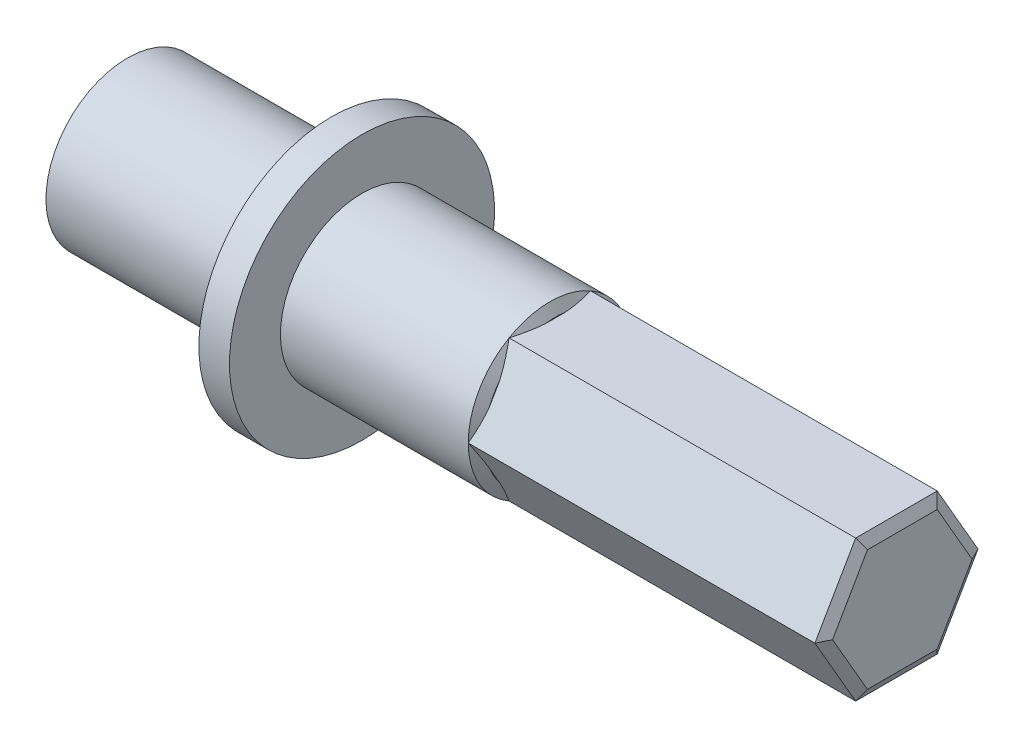
ISO-10303-21;
HEADER;
FILE_DESCRIPTION(('STEP AP214'),'2;1');
FILE_NAME('part.step','',(''),(''),'','','');
FILE_SCHEMA(('AUTOMOTIVE_DESIGN { 1 0 10303 214 1 1 1 1 }'));
ENDSEC;
DATA;
#1=APPLICATION_CONTEXT('core data for automotive mechanical design processes');
#2=APPLICATION_PROTOCOL_DEFINITION('international standard','automotive_design',2000,#1);
#3=PRODUCT_CONTEXT('',#1,'mechanical');
#4=PRODUCT('Part','Part','',(#3));
#5=PRODUCT_RELATED_PRODUCT_CATEGORY('part','',(#4));
#6=PRODUCT_DEFINITION_FORMATION('','',#4);
#7=PRODUCT_DEFINITION_CONTEXT('part definition',#1,'design');
#8=PRODUCT_DEFINITION('design','',#6,#7);
#9=PRODUCT_DEFINITION_SHAPE('','',#8);
#10=(LENGTH_UNIT() NAMED_UNIT(*) SI_UNIT(.MILLI.,.METRE.));
#11=(NAMED_UNIT(*) PLANE_ANGLE_UNIT() SI_UNIT($,.RADIAN.));
#12=(NAMED_UNIT(*) SI_UNIT($,.STERADIAN.) SOLID_ANGLE_UNIT());
#13=UNCERTAINTY_MEASURE_WITH_UNIT(LENGTH_MEASURE(1.E-05),#10,'distance_accuracy_value','');
#14=(GEOMETRIC_REPRESENTATION_CONTEXT(3) GLOBAL_UNCERTAINTY_ASSIGNED_CONTEXT((#13)) GLOBAL_UNIT_ASSIGNED_CONTEXT((#10,
#11,#12)) REPRESENTATION_CONTEXT('',''));
#15=CARTESIAN_POINT('',(0.,0.,0.));
#16=DIRECTION('',(0.,0.,1.));
#17=DIRECTION('',(1.,0.,0.));
#18=AXIS2_PLACEMENT_3D('',#15,#16,#17);
#19=CARTESIAN_POINT('',(28.,4.,0.));
#20=DIRECTION('',(1.,0.,0.));
#21=DIRECTION('',(0.,1.,0.));
#22=AXIS2_PLACEMENT_3D('',#19,#20,#21);
#23=PLANE('',#22);
#24=DIRECTION('',(0.,0.,1.));
#25=VECTOR('',#24,1.);
#26=CARTESIAN_POINT('',(28.,2.96410161513775,0.));
#27=LINE('',#26,#25);
#28=CARTESIAN_POINT('',(28.,2.96410161513775,-1.71132486540518));
#29=VERTEX_POINT('',#28);
#30=CARTESIAN_POINT('',(28.,2.96410161513775,1.71132486540518));
#31=VERTEX_POINT('',#30);
#32=EDGE_CURVE('E459',#29,#31,#27,.T.);
#33=ORIENTED_EDGE('',*,*,#32,.T.);
#34=DIRECTION('',(0.,-0.866025403784439,0.5));
#35=VECTOR('',#34,1.);
#36=CARTESIAN_POINT('',(28.,4.48205080756887,0.834936490538898));
#37=LINE('',#36,#35);
#38=CARTESIAN_POINT('',(28.,0.,3.42264973081036));
#39=VERTEX_POINT('',#38);
#40=EDGE_CURVE('E475',#31,#39,#37,.T.);
#41=ORIENTED_EDGE('',*,*,#40,.T.);
#42=DIRECTION('',(0.,-0.866025403784439,-0.5));
#43=VECTOR('',#42,1.);
#44=CARTESIAN_POINT('',(28.,1.51794919243113,4.29903810567665));
#45=LINE('',#44,#43);
#46=CARTESIAN_POINT('',(28.,-2.96410161513775,1.71132486540518));
#47=VERTEX_POINT('',#46);
#48=EDGE_CURVE('E485',#39,#47,#45,.T.);
#49=ORIENTED_EDGE('',*,*,#48,.T.);
#50=DIRECTION('',(0.,0.,-1.));
#51=VECTOR('',#50,1.);
#52=CARTESIAN_POINT('',(28.,-2.96410161513775,0.));
#53=LINE('',#52,#51);
#54=CARTESIAN_POINT('',(28.,-2.96410161513775,-1.71132486540518));
#55=VERTEX_POINT('',#54);
#56=EDGE_CURVE('E483',#47,#55,#53,.T.);
#57=ORIENTED_EDGE('',*,*,#56,.T.);
#58=DIRECTION('',(0.,0.866025403784439,-0.5));
#59=VECTOR('',#58,1.);
#60=CARTESIAN_POINT('',(28.,1.51794919243113,-4.29903810567665));
#61=LINE('',#60,#59);
#62=CARTESIAN_POINT('',(28.,0.,-3.42264973081037));
#63=VERTEX_POINT('',#62);
#64=EDGE_CURVE('E481',#55,#63,#61,.T.);
#65=ORIENTED_EDGE('',*,*,#64,.T.);
#66=DIRECTION('',(0.,0.866025403784439,0.5));
#67=VECTOR('',#66,1.);
#68=CARTESIAN_POINT('',(28.,4.48205080756887,-0.8349364905389));
#69=LINE('',#68,#67);
#70=EDGE_CURVE('E479',#63,#29,#69,.T.);
#71=ORIENTED_EDGE('',*,*,#70,.T.);
#72=EDGE_LOOP('',(#33,#41,#49,#57,#65,#71));
#73=FACE_BOUND('',#72,.T.);
#74=ADVANCED_FACE('F54',(#73),#23,.T.);
#75=CARTESIAN_POINT('',(28.,0.,0.));
#76=DIRECTION('',(1.,0.,0.));
#77=DIRECTION('',(0.,1.,0.));
#78=AXIS2_PLACEMENT_3D('',#75,#76,#77);
#79=CYLINDRICAL_SURFACE('',#78,4.);
#80=CARTESIAN_POINT('',(10.7113248654052,0.,0.));
#81=DIRECTION('',(-1.,0.,0.));
#82=DIRECTION('',(0.,-1.,0.));
#83=AXIS2_PLACEMENT_3D('',#80,#81,#82);
#84=CIRCLE('',#83,4.);
#85=CARTESIAN_POINT('',(10.7113248654052,3.46410161513775,2.00000000000001));
#86=VERTEX_POINT('',#85);
#87=CARTESIAN_POINT('',(10.7113248654052,3.46410161513776,-1.99999999999998));
#88=VERTEX_POINT('',#87);
#89=EDGE_CURVE('E184',#86,#88,#84,.T.);
#90=ORIENTED_EDGE('',*,*,#89,.T.);
#91=CARTESIAN_POINT('',(10.7113248654052,0.,0.));
#92=DIRECTION('',(-1.,0.,0.));
#93=DIRECTION('',(0.,-1.,0.));
#94=AXIS2_PLACEMENT_3D('',#91,#92,#93);
#95=CIRCLE('',#94,4.);
#96=CARTESIAN_POINT('',(10.7113248654052,0.,-4.));
#97=VERTEX_POINT('',#96);
#98=EDGE_CURVE('E206',#88,#97,#95,.T.);
#99=ORIENTED_EDGE('',*,*,#98,.T.);
#100=CARTESIAN_POINT('',(10.7113248654052,0.,0.));
#101=DIRECTION('',(-1.,0.,0.));
#102=DIRECTION('',(0.,-1.,0.));
#103=AXIS2_PLACEMENT_3D('',#100,#101,#102);
#104=CIRCLE('',#103,4.);
#105=CARTESIAN_POINT('',(10.7113248654052,-3.46410161513774,-2.00000000000001));
#106=VERTEX_POINT('',#105);
#107=EDGE_CURVE('E203',#97,#106,#104,.T.);
#108=ORIENTED_EDGE('',*,*,#107,.T.);
#109=CARTESIAN_POINT('',(10.7113248654052,0.,0.));
#110=DIRECTION('',(-1.,0.,0.));
#111=DIRECTION('',(0.,-1.,0.));
#112=AXIS2_PLACEMENT_3D('',#109,#110,#111);
#113=CIRCLE('',#112,4.);
#114=CARTESIAN_POINT('',(10.7113248654052,-3.46410161513776,1.99999999999998));
#115=VERTEX_POINT('',#114);
#116=EDGE_CURVE('E200',#106,#115,#113,.T.);
#117=ORIENTED_EDGE('',*,*,#116,.T.);
#118=CARTESIAN_POINT('',(10.7113248654052,0.,0.));
#119=DIRECTION('',(-1.,0.,0.));
#120=DIRECTION('',(0.,-1.,0.));
#121=AXIS2_PLACEMENT_3D('',#118,#119,#120);
#122=CIRCLE('',#121,4.);
#123=CARTESIAN_POINT('',(10.7113248654052,0.,4.));
#124=VERTEX_POINT('',#123);
#125=EDGE_CURVE('E197',#115,#124,#122,.T.);
#126=ORIENTED_EDGE('',*,*,#125,.T.);
#127=CARTESIAN_POINT('',(10.7113248654052,0.,0.));
#128=DIRECTION('',(-1.,0.,0.));
#129=DIRECTION('',(0.,-1.,0.));
#130=AXIS2_PLACEMENT_3D('',#127,#128,#129);
#131=CIRCLE('',#130,4.);
#132=EDGE_CURVE('E188',#124,#86,#131,.T.);
#133=ORIENTED_EDGE('',*,*,#132,.T.);
#134=EDGE_LOOP('',(#90,#99,#108,#117,#126,#133));
#135=FACE_BOUND('',#134,.T.);
#136=CARTESIAN_POINT('',(1.5,0.,0.));
#137=DIRECTION('',(1.,0.,0.));
#138=DIRECTION('',(0.,1.,0.));
#139=AXIS2_PLACEMENT_3D('',#136,#137,#138);
#140=CIRCLE('',#139,4.);
#141=CARTESIAN_POINT('',(1.5,4.,0.));
#142=VERTEX_POINT('',#141);
#143=EDGE_CURVE('E420',#142,#142,#140,.T.);
#144=ORIENTED_EDGE('',*,*,#143,.T.);
#145=EDGE_LOOP('',(#144));
#146=FACE_BOUND('',#145,.T.);
#147=ADVANCED_FACE('F331',(#135,#146),#79,.T.);
#148=CARTESIAN_POINT('',(-10.,0.,0.));
#149=DIRECTION('',(-1.,0.,0.));
#150=DIRECTION('',(0.,-1.,0.));
#151=AXIS2_PLACEMENT_3D('',#148,#149,#150);
#152=PLANE('',#151);
#153=CARTESIAN_POINT('',(-10.,0.,0.));
#154=DIRECTION('',(1.,0.,0.));
#155=DIRECTION('',(0.,1.,0.));
#156=AXIS2_PLACEMENT_3D('',#153,#154,#155);
#157=CIRCLE('',#156,4.);
#158=CARTESIAN_POINT('',(-10.,4.,0.));
#159=VERTEX_POINT('',#158);
#160=EDGE_CURVE('E185',#159,#159,#157,.T.);
#161=ORIENTED_EDGE('',*,*,#160,.F.);
#162=EDGE_LOOP('',(#161));
#163=FACE_BOUND('',#162,.T.);
#164=ADVANCED_FACE('F336',(#163),#152,.T.);
#165=CARTESIAN_POINT('',(28.,0.,0.));
#166=DIRECTION('',(1.,0.,0.));
#167=DIRECTION('',(0.,1.,0.));
#168=AXIS2_PLACEMENT_3D('',#165,#166,#167);
#169=CYLINDRICAL_SURFACE('',#168,4.);
#170=ORIENTED_EDGE('',*,*,#160,.T.);
#171=EDGE_LOOP('',(#170));
#172=FACE_BOUND('',#171,.T.);
#173=CARTESIAN_POINT('',(0.,0.,0.));
#174=DIRECTION('',(1.,0.,0.));
#175=DIRECTION('',(0.,1.,0.));
#176=AXIS2_PLACEMENT_3D('',#173,#174,#175);
#177=CIRCLE('',#176,4.);
#178=CARTESIAN_POINT('',(0.,4.,0.));
#179=VERTEX_POINT('',#178);
#180=EDGE_CURVE('E191',#179,#179,#177,.T.);
#181=ORIENTED_EDGE('',*,*,#180,.F.);
#182=EDGE_LOOP('',(#181));
#183=FACE_BOUND('',#182,.T.);
#184=ADVANCED_FACE('F342',(#172,#183),#169,.T.);
#185=CARTESIAN_POINT('',(0.,4.,0.));
#186=DIRECTION('',(-1.,0.,0.));
#187=DIRECTION('',(0.,-1.,0.));
#188=AXIS2_PLACEMENT_3D('',#185,#186,#187);
#189=PLANE('',#188);
#190=ORIENTED_EDGE('',*,*,#180,.T.);
#191=EDGE_LOOP('',(#190));
#192=FACE_BOUND('',#191,.T.);
#193=CARTESIAN_POINT('',(0.,0.,0.));
#194=DIRECTION('',(1.,0.,0.));
#195=DIRECTION('',(0.,1.,0.));
#196=AXIS2_PLACEMENT_3D('',#193,#194,#195);
#197=CIRCLE('',#196,6.5);
#198=CARTESIAN_POINT('',(0.,6.5,0.));
#199=VERTEX_POINT('',#198);
#200=EDGE_CURVE('E428',#199,#199,#197,.T.);
#201=ORIENTED_EDGE('',*,*,#200,.F.);
#202=EDGE_LOOP('',(#201));
#203=FACE_BOUND('',#202,.T.);
#204=ADVANCED_FACE('F346',(#192,#203),#189,.T.);
#205=CARTESIAN_POINT('',(28.,0.,0.));
#206=DIRECTION('',(1.,0.,0.));
#207=DIRECTION('',(0.,1.,0.));
#208=AXIS2_PLACEMENT_3D('',#205,#206,#207);
#209=CYLINDRICAL_SURFACE('',#208,6.5);
#210=ORIENTED_EDGE('',*,*,#200,.T.);
#211=EDGE_LOOP('',(#210));
#212=FACE_BOUND('',#211,.T.);
#213=CARTESIAN_POINT('',(1.5,0.,0.));
#214=DIRECTION('',(1.,0.,0.));
#215=DIRECTION('',(0.,1.,0.));
#216=AXIS2_PLACEMENT_3D('',#213,#214,#215);
#217=CIRCLE('',#216,6.5);
#218=CARTESIAN_POINT('',(1.5,6.5,0.));
#219=VERTEX_POINT('',#218);
#220=EDGE_CURVE('E425',#219,#219,#217,.T.);
#221=ORIENTED_EDGE('',*,*,#220,.F.);
#222=EDGE_LOOP('',(#221));
#223=FACE_BOUND('',#222,.T.);
#224=ADVANCED_FACE('F350',(#212,#223),#209,.T.);
#225=CARTESIAN_POINT('',(1.5,6.5,0.));
#226=DIRECTION('',(1.,0.,0.));
#227=DIRECTION('',(0.,1.,0.));
#228=AXIS2_PLACEMENT_3D('',#225,#226,#227);
#229=PLANE('',#228);
#230=ORIENTED_EDGE('',*,*,#220,.T.);
#231=EDGE_LOOP('',(#230));
#232=FACE_BOUND('',#231,.T.);
#233=ORIENTED_EDGE('',*,*,#143,.F.);
#234=EDGE_LOOP('',(#233));
#235=FACE_BOUND('',#234,.T.);
#236=ADVANCED_FACE('F354',(#232,#235),#229,.T.);
#237=CARTESIAN_POINT('',(11.,4.,0.));
#238=DIRECTION('',(-1.,0.,0.));
#239=DIRECTION('',(0.,-1.,0.));
#240=AXIS2_PLACEMENT_3D('',#237,#238,#239);
#241=PLANE('',#240);
#242=DIRECTION('',(0.,0.,1.));
#243=VECTOR('',#242,1.);
#244=CARTESIAN_POINT('',(11.,3.46410161513775,0.));
#245=LINE('',#244,#243);
#246=CARTESIAN_POINT('',(11.,3.46410161513775,-0.499999999999988));
#247=VERTEX_POINT('',#246);
#248=CARTESIAN_POINT('',(11.,3.46410161513775,0.499999999999987));
#249=VERTEX_POINT('',#248);
#250=EDGE_CURVE('E412',#247,#249,#245,.T.);
#251=ORIENTED_EDGE('',*,*,#250,.F.);
#252=CARTESIAN_POINT('',(11.,0.,0.));
#253=DIRECTION('',(-1.,0.,0.));
#254=DIRECTION('',(0.,-1.,0.));
#255=AXIS2_PLACEMENT_3D('',#252,#253,#254);
#256=CIRCLE('',#255,3.5);
#257=EDGE_CURVE('E217',#247,#249,#256,.F.);
#258=ORIENTED_EDGE('',*,*,#257,.T.);
#259=EDGE_LOOP('',(#251,#258));
#260=FACE_BOUND('',#259,.T.);
#261=ADVANCED_FACE('F357',(#260),#241,.F.);
#262=CARTESIAN_POINT('',(-4.03573872777933,3.46410161513775,0.));
#263=DIRECTION('',(0.,1.,0.));
#264=DIRECTION('',(0.,0.,1.));
#265=AXIS2_PLACEMENT_3D('',#262,#263,#264);
#266=PLANE('',#265);
#267=DIRECTION('',(1.,0.,0.));
#268=VECTOR('',#267,1.);
#269=CARTESIAN_POINT('',(-4.03573872777933,3.46410161513775,2.));
#270=LINE('',#269,#268);
#271=CARTESIAN_POINT('',(27.7113248654052,3.46410161513775,2.));
#272=VERTEX_POINT('',#271);
#273=EDGE_CURVE('E415',#86,#272,#270,.T.);
#274=ORIENTED_EDGE('',*,*,#273,.T.);
#275=DIRECTION('',(0.,0.,-1.));
#276=VECTOR('',#275,1.);
#277=CARTESIAN_POINT('',(27.7113248654052,3.46410161513775,0.));
#278=LINE('',#277,#276);
#279=CARTESIAN_POINT('',(27.7113248654052,3.46410161513775,-2.));
#280=VERTEX_POINT('',#279);
#281=EDGE_CURVE('E452',#272,#280,#278,.T.);
#282=ORIENTED_EDGE('',*,*,#281,.T.);
#283=DIRECTION('',(1.,0.,0.));
#284=VECTOR('',#283,1.);
#285=CARTESIAN_POINT('',(-4.03573872777933,3.46410161513775,-2.));
#286=LINE('',#285,#284);
#287=EDGE_CURVE('E418',#88,#280,#286,.T.);
#288=ORIENTED_EDGE('',*,*,#287,.F.);
#289=CARTESIAN_POINT('',(10.7113248654052,3.46410161513775,-2.));
#290=CARTESIAN_POINT('',(10.7467097894488,3.46410161513775,-1.87739674987939));
#291=CARTESIAN_POINT('',(10.7798660183443,3.46410161513775,-1.75411046031265));
#292=CARTESIAN_POINT('',(10.8407340080672,3.46410161513775,-1.50653263052453));
#293=CARTESIAN_POINT('',(10.8684590989994,3.46410161513775,-1.38224435131088));
#294=CARTESIAN_POINT('',(10.917674956433,3.46410161513775,-1.13235092918292));
#295=CARTESIAN_POINT('',(10.9391626055733,3.46410161513775,-1.0067451601911));
#296=CARTESIAN_POINT('',(10.9751031981516,3.46410161513775,-0.754219210198875));
#297=CARTESIAN_POINT('',(10.9895384810765,3.46410161513775,-0.627296534032624));
#298=CARTESIAN_POINT('',(11.,3.46410161513775,-0.499999999999959));
#299=B_SPLINE_CURVE_WITH_KNOTS('',3,(#289,#290,#291,#292,#293,#294,#295,#296,#297,#298),
.UNSPECIFIED.,.F.,.F.,(4,2,2,2,4),(0.,0.382857244019682,0.764762699916726,1.14685869795227,
1.52990669660289),.UNSPECIFIED.);
#300=EDGE_CURVE('E486',#88,#247,#299,.T.);
#301=ORIENTED_EDGE('',*,*,#300,.T.);
#302=ORIENTED_EDGE('',*,*,#250,.T.);
#303=CARTESIAN_POINT('',(11.,3.46410161513775,0.499999999999989));
#304=CARTESIAN_POINT('',(10.9895384810765,3.46410161513775,0.627296534032651));
#305=CARTESIAN_POINT('',(10.9751031981516,3.46410161513775,0.754219210198898));
#306=CARTESIAN_POINT('',(10.9391626055733,3.46410161513775,1.00674516019112));
#307=CARTESIAN_POINT('',(10.917674956433,3.46410161513775,1.13235092918293));
#308=CARTESIAN_POINT('',(10.8684590989993,3.46410161513775,1.38224435131089));
#309=CARTESIAN_POINT('',(10.8407340080672,3.46410161513775,1.50653263052453));
#310=CARTESIAN_POINT('',(10.7798660183443,3.46410161513775,1.75411046031266));
#311=CARTESIAN_POINT('',(10.7467097894488,3.46410161513775,1.87739674987939));
#312=CARTESIAN_POINT('',(10.7113248654052,3.46410161513775,2.));
#313=B_SPLINE_CURVE_WITH_KNOTS('',3,(#303,#304,#305,#306,#307,#308,#309,#310,#311,#312),
.UNSPECIFIED.,.F.,.F.,(4,2,2,2,4),(0.,0.383047998650611,0.765143996686143,1.14704945258318,
1.52990669660285),.UNSPECIFIED.);
#314=EDGE_CURVE('E267',#249,#86,#313,.T.);
#315=ORIENTED_EDGE('',*,*,#314,.T.);
#316=EDGE_LOOP('',(#274,#282,#288,#301,#302,#315));
#317=FACE_BOUND('',#316,.T.);
#318=ADVANCED_FACE('F363',(#317),#266,.T.);
#319=CARTESIAN_POINT('',(11.,4.,0.));
#320=DIRECTION('',(-1.,0.,0.));
#321=DIRECTION('',(0.,-1.,0.));
#322=AXIS2_PLACEMENT_3D('',#319,#320,#321);
#323=PLANE('',#322);
#324=DIRECTION('',(0.,-0.866025403784439,-0.5));
#325=VECTOR('',#324,1.);
#326=CARTESIAN_POINT('',(11.,-1.73205080756888,3.));
#327=LINE('',#326,#325);
#328=CARTESIAN_POINT('',(11.,-1.29903810567666,3.24999999999999));
#329=VERTEX_POINT('',#328);
#330=CARTESIAN_POINT('',(11.,-2.16506350946109,2.75));
#331=VERTEX_POINT('',#330);
#332=EDGE_CURVE('E385',#329,#331,#327,.T.);
#333=ORIENTED_EDGE('',*,*,#332,.F.);
#334=CARTESIAN_POINT('',(11.,0.,0.));
#335=DIRECTION('',(-1.,0.,0.));
#336=DIRECTION('',(0.,-1.,0.));
#337=AXIS2_PLACEMENT_3D('',#334,#335,#336);
#338=CIRCLE('',#337,3.5);
#339=EDGE_CURVE('E213',#329,#331,#338,.F.);
#340=ORIENTED_EDGE('',*,*,#339,.T.);
#341=EDGE_LOOP('',(#333,#340));
#342=FACE_BOUND('',#341,.T.);
#343=ADVANCED_FACE('F360',(#342),#323,.F.);
#344=CARTESIAN_POINT('',(-4.03573872777933,-1.73205080756888,3.));
#345=DIRECTION('',(0.,-0.5,0.866025403784439));
#346=DIRECTION('',(0.,-0.866025403784439,-0.5));
#347=AXIS2_PLACEMENT_3D('',#344,#345,#346);
#348=PLANE('',#347);
#349=DIRECTION('',(1.,0.,0.));
#350=VECTOR('',#349,1.);
#351=CARTESIAN_POINT('',(-4.03573872777933,-3.46410161513775,2.));
#352=LINE('',#351,#350);
#353=CARTESIAN_POINT('',(27.7113248654052,-3.46410161513775,2.));
#354=VERTEX_POINT('',#353);
#355=EDGE_CURVE('E383',#115,#354,#352,.T.);
#356=ORIENTED_EDGE('',*,*,#355,.T.);
#357=DIRECTION('',(0.,0.866025403784439,0.5));
#358=VECTOR('',#357,1.);
#359=CARTESIAN_POINT('',(27.7113248654052,-1.73205080756888,3.));
#360=LINE('',#359,#358);
#361=CARTESIAN_POINT('',(27.7113248654052,0.,4.));
#362=VERTEX_POINT('',#361);
#363=EDGE_CURVE('E13',#354,#362,#360,.T.);
#364=ORIENTED_EDGE('',*,*,#363,.T.);
#365=DIRECTION('',(1.,0.,0.));
#366=VECTOR('',#365,1.);
#367=CARTESIAN_POINT('',(-4.03573872777933,0.,4.));
#368=LINE('',#367,#366);
#369=EDGE_CURVE('E181',#124,#362,#368,.T.);
#370=ORIENTED_EDGE('',*,*,#369,.F.);
#371=CARTESIAN_POINT('',(10.7113248654052,0.,4.));
#372=CARTESIAN_POINT('',(10.7467097894488,-0.106177529190987,3.93869837493969));
#373=CARTESIAN_POINT('',(10.7798660183443,-0.212946587894101,3.87705523015632));
#374=CARTESIAN_POINT('',(10.8407340080672,-0.42735527790444,3.75326631526226));
#375=CARTESIAN_POINT('',(10.8684590989994,-0.534992085096109,3.69112217565544));
#376=CARTESIAN_POINT('',(10.917674956433,-0.751406136897555,3.56617546459146));
#377=CARTESIAN_POINT('',(10.9391626055733,-0.860183923706344,3.50337258009555));
#378=CARTESIAN_POINT('',(10.9751031981516,-1.07887781151441,3.37710960509944));
#379=CARTESIAN_POINT('',(10.9895384810765,-1.18879607339069,3.31364826701631));
#380=CARTESIAN_POINT('',(11.,-1.29903810567669,3.24999999999998));
#381=B_SPLINE_CURVE_WITH_KNOTS('',3,(#371,#372,#373,#374,#375,#376,#377,#378,#379,#380),
.UNSPECIFIED.,.F.,.F.,(4,2,2,2,4),(0.,0.382857244019681,0.764762699916724,1.14685869795226,
1.52990669660288),.UNSPECIFIED.);
#382=EDGE_CURVE('E371',#124,#329,#381,.T.);
#383=ORIENTED_EDGE('',*,*,#382,.T.);
#384=ORIENTED_EDGE('',*,*,#332,.T.);
#385=CARTESIAN_POINT('',(11.,-2.16506350946109,2.75));
#386=CARTESIAN_POINT('',(10.9895384810765,-2.27530554174708,2.68635173298367));
#387=CARTESIAN_POINT('',(10.9751031981516,-2.38522380362336,2.62289039490055));
#388=CARTESIAN_POINT('',(10.9391626055733,-2.60391769143142,2.49662741990444));
#389=CARTESIAN_POINT('',(10.917674956433,-2.71269547824021,2.43382453540853));
#390=CARTESIAN_POINT('',(10.8684590989993,-2.92910953004165,2.30887782434455));
#391=CARTESIAN_POINT('',(10.8407340080672,-3.03674633723332,2.24673368473773));
#392=CARTESIAN_POINT('',(10.7798660183443,-3.25115502724365,2.12294476984367));
#393=CARTESIAN_POINT('',(10.7467097894488,-3.35792408594676,2.0613016250603));
#394=CARTESIAN_POINT('',(10.7113248654052,-3.46410161513775,2.));
#395=B_SPLINE_CURVE_WITH_KNOTS('',3,(#385,#386,#387,#388,#389,#390,#391,#392,#393,#394),
.UNSPECIFIED.,.F.,.F.,(4,2,2,2,4),(0.,0.38304799865061,0.765143996686141,1.14704945258317,
1.52990669660285),.UNSPECIFIED.);
#396=EDGE_CURVE('E314',#331,#115,#395,.T.);
#397=ORIENTED_EDGE('',*,*,#396,.T.);
#398=EDGE_LOOP('',(#356,#364,#370,#383,#384,#397));
#399=FACE_BOUND('',#398,.T.);
#400=ADVANCED_FACE('F362',(#399),#348,.T.);
#401=CARTESIAN_POINT('',(11.,4.,0.));
#402=DIRECTION('',(-1.,0.,0.));
#403=DIRECTION('',(0.,-1.,0.));
#404=AXIS2_PLACEMENT_3D('',#401,#402,#403);
#405=PLANE('',#404);
#406=DIRECTION('',(0.,0.866025403784439,-0.5));
#407=VECTOR('',#406,1.);
#408=CARTESIAN_POINT('',(11.,-1.73205080756887,-3.));
#409=LINE('',#408,#407);
#410=CARTESIAN_POINT('',(11.,-2.16506350946108,-2.75));
#411=VERTEX_POINT('',#410);
#412=CARTESIAN_POINT('',(11.,-1.29903810567666,-3.24999999999999));
#413=VERTEX_POINT('',#412);
#414=EDGE_CURVE('E405',#411,#413,#409,.T.);
#415=ORIENTED_EDGE('',*,*,#414,.F.);
#416=CARTESIAN_POINT('',(11.,0.,0.));
#417=DIRECTION('',(-1.,0.,0.));
#418=DIRECTION('',(0.,-1.,0.));
#419=AXIS2_PLACEMENT_3D('',#416,#417,#418);
#420=CIRCLE('',#419,3.5);
#421=EDGE_CURVE('E209',#411,#413,#420,.F.);
#422=ORIENTED_EDGE('',*,*,#421,.T.);
#423=EDGE_LOOP('',(#415,#422));
#424=FACE_BOUND('',#423,.T.);
#425=ADVANCED_FACE('F368',(#424),#405,.F.);
#426=CARTESIAN_POINT('',(-4.03573872777933,-1.73205080756888,-3.));
#427=DIRECTION('',(0.,-0.5,-0.866025403784439));
#428=DIRECTION('',(0.,0.866025403784439,-0.5));
#429=AXIS2_PLACEMENT_3D('',#426,#427,#428);
#430=PLANE('',#429);
#431=DIRECTION('',(1.,0.,0.));
#432=VECTOR('',#431,1.);
#433=CARTESIAN_POINT('',(-4.03573872777933,0.,-4.));
#434=LINE('',#433,#432);
#435=CARTESIAN_POINT('',(27.7113248654052,0.,-4.));
#436=VERTEX_POINT('',#435);
#437=EDGE_CURVE('E169',#97,#436,#434,.T.);
#438=ORIENTED_EDGE('',*,*,#437,.T.);
#439=DIRECTION('',(0.,-0.866025403784439,0.5));
#440=VECTOR('',#439,1.);
#441=CARTESIAN_POINT('',(27.7113248654052,-1.73205080756887,-3.));
#442=LINE('',#441,#440);
#443=CARTESIAN_POINT('',(27.7113248654052,-3.46410161513775,-2.));
#444=VERTEX_POINT('',#443);
#445=EDGE_CURVE('E79',#436,#444,#442,.T.);
#446=ORIENTED_EDGE('',*,*,#445,.T.);
#447=DIRECTION('',(1.,0.,0.));
#448=VECTOR('',#447,1.);
#449=CARTESIAN_POINT('',(-4.03573872777933,-3.46410161513775,-2.));
#450=LINE('',#449,#448);
#451=EDGE_CURVE('E397',#106,#444,#450,.T.);
#452=ORIENTED_EDGE('',*,*,#451,.F.);
#453=CARTESIAN_POINT('',(10.7113248654052,-3.46410161513775,-2.));
#454=CARTESIAN_POINT('',(10.7467097894488,-3.35792408594677,-2.0613016250603));
#455=CARTESIAN_POINT('',(10.7798660183443,-3.25115502724365,-2.12294476984367));
#456=CARTESIAN_POINT('',(10.8407340080672,-3.03674633723331,-2.24673368473774));
#457=CARTESIAN_POINT('',(10.8684590989994,-2.92910953004164,-2.30887782434456));
#458=CARTESIAN_POINT('',(10.917674956433,-2.7126954782402,-2.43382453540854));
#459=CARTESIAN_POINT('',(10.9391626055733,-2.60391769143141,-2.49662741990445));
#460=CARTESIAN_POINT('',(10.9751031981516,-2.38522380362334,-2.62289039490056));
#461=CARTESIAN_POINT('',(10.9895384810765,-2.27530554174706,-2.68635173298369));
#462=CARTESIAN_POINT('',(11.,-2.16506350946106,-2.75000000000002));
#463=B_SPLINE_CURVE_WITH_KNOTS('',3,(#453,#454,#455,#456,#457,#458,#459,#460,#461,#462),
.UNSPECIFIED.,.F.,.F.,(4,2,2,2,4),(0.,0.382857244019684,0.764762699916727,1.14685869795227,
1.52990669660289),.UNSPECIFIED.);
#464=EDGE_CURVE('E507',#106,#411,#463,.T.);
#465=ORIENTED_EDGE('',*,*,#464,.T.);
#466=ORIENTED_EDGE('',*,*,#414,.T.);
#467=CARTESIAN_POINT('',(11.,-1.29903810567666,-3.24999999999999));
#468=CARTESIAN_POINT('',(10.9895384810765,-1.18879607339067,-3.31364826701633));
#469=CARTESIAN_POINT('',(10.9751031981516,-1.07887781151439,-3.37710960509945));
#470=CARTESIAN_POINT('',(10.9391626055733,-0.860183923706327,-3.50337258009556));
#471=CARTESIAN_POINT('',(10.917674956433,-0.751406136897541,-3.56617546459146));
#472=CARTESIAN_POINT('',(10.8684590989993,-0.534992085096099,-3.69112217565544));
#473=CARTESIAN_POINT('',(10.8407340080672,-0.427355277904433,-3.75326631526226));
#474=CARTESIAN_POINT('',(10.7798660183443,-0.212946587894099,-3.87705523015633));
#475=CARTESIAN_POINT('',(10.7467097894488,-0.106177529190988,-3.93869837493969));
#476=CARTESIAN_POINT('',(10.7113248654052,0.,-3.99999999999999));
#477=B_SPLINE_CURVE_WITH_KNOTS('',3,(#467,#468,#469,#470,#471,#472,#473,#474,#475,#476),
.UNSPECIFIED.,.F.,.F.,(4,2,2,2,4),(0.,0.383047998650609,0.76514399668614,1.14704945258317,
1.52990669660285),.UNSPECIFIED.);
#478=EDGE_CURVE('E174',#413,#97,#477,.T.);
#479=ORIENTED_EDGE('',*,*,#478,.T.);
#480=EDGE_LOOP('',(#438,#446,#452,#465,#466,#479));
#481=FACE_BOUND('',#480,.T.);
#482=ADVANCED_FACE('F244',(#481),#430,.T.);
#483=CARTESIAN_POINT('',(11.,4.,0.));
#484=DIRECTION('',(-1.,0.,0.));
#485=DIRECTION('',(0.,-1.,0.));
#486=AXIS2_PLACEMENT_3D('',#483,#484,#485);
#487=PLANE('',#486);
#488=DIRECTION('',(0.,0.866025403784439,0.5));
#489=VECTOR('',#488,1.);
#490=CARTESIAN_POINT('',(11.,1.73205080756887,-3.));
#491=LINE('',#490,#489);
#492=CARTESIAN_POINT('',(11.,1.29903810567666,-3.25));
#493=VERTEX_POINT('',#492);
#494=CARTESIAN_POINT('',(11.,2.16506350946109,-2.75));
#495=VERTEX_POINT('',#494);
#496=EDGE_CURVE('E168',#493,#495,#491,.T.);
#497=ORIENTED_EDGE('',*,*,#496,.F.);
#498=CARTESIAN_POINT('',(11.,0.,0.));
#499=DIRECTION('',(-1.,0.,0.));
#500=DIRECTION('',(0.,-1.,0.));
#501=AXIS2_PLACEMENT_3D('',#498,#499,#500);
#502=CIRCLE('',#501,3.5);
#503=EDGE_CURVE('E180',#493,#495,#502,.F.);
#504=ORIENTED_EDGE('',*,*,#503,.T.);
#505=EDGE_LOOP('',(#497,#504));
#506=FACE_BOUND('',#505,.T.);
#507=ADVANCED_FACE('F179',(#506),#487,.F.);
#508=CARTESIAN_POINT('',(-4.03573872777933,1.73205080756887,-3.));
#509=DIRECTION('',(0.,0.5,-0.866025403784439));
#510=DIRECTION('',(0.,0.866025403784439,0.5));
#511=AXIS2_PLACEMENT_3D('',#508,#509,#510);
#512=PLANE('',#511);
#513=ORIENTED_EDGE('',*,*,#287,.T.);
#514=DIRECTION('',(0.,-0.866025403784439,-0.5));
#515=VECTOR('',#514,1.);
#516=CARTESIAN_POINT('',(27.7113248654052,1.73205080756888,-3.));
#517=LINE('',#516,#515);
#518=EDGE_CURVE('E441',#280,#436,#517,.T.);
#519=ORIENTED_EDGE('',*,*,#518,.T.);
#520=ORIENTED_EDGE('',*,*,#437,.F.);
#521=CARTESIAN_POINT('',(10.7113248654052,0.,-4.));
#522=CARTESIAN_POINT('',(10.7467097894488,0.106177529190986,-3.93869837493969));
#523=CARTESIAN_POINT('',(10.7798660183443,0.2129465878941,-3.87705523015633));
#524=CARTESIAN_POINT('',(10.8407340080672,0.427355277904439,-3.75326631526226));
#525=CARTESIAN_POINT('',(10.8684590989994,0.534992085096108,-3.69112217565544));
#526=CARTESIAN_POINT('',(10.917674956433,0.751406136897554,-3.56617546459146));
#527=CARTESIAN_POINT('',(10.9391626055733,0.860183923706343,-3.50337258009555));
#528=CARTESIAN_POINT('',(10.9751031981516,1.07887781151441,-3.37710960509944));
#529=CARTESIAN_POINT('',(10.9895384810765,1.18879607339069,-3.31364826701631));
#530=CARTESIAN_POINT('',(11.,1.29903810567669,-3.24999999999998));
#531=B_SPLINE_CURVE_WITH_KNOTS('',3,(#521,#522,#523,#524,#525,#526,#527,#528,#529,#530),
.UNSPECIFIED.,.F.,.F.,(4,2,2,2,4),(0.,0.382857244019682,0.764762699916724,1.14685869795226,
1.52990669660288),.UNSPECIFIED.);
#532=EDGE_CURVE('E163',#97,#493,#531,.T.);
#533=ORIENTED_EDGE('',*,*,#532,.T.);
#534=ORIENTED_EDGE('',*,*,#496,.T.);
#535=CARTESIAN_POINT('',(11.,2.16506350946109,-2.75));
#536=CARTESIAN_POINT('',(10.9895384810765,2.27530554174709,-2.68635173298367));
#537=CARTESIAN_POINT('',(10.9751031981516,2.38522380362336,-2.62289039490055));
#538=CARTESIAN_POINT('',(10.9391626055733,2.60391769143143,-2.49662741990443));
#539=CARTESIAN_POINT('',(10.917674956433,2.71269547824021,-2.43382453540853));
#540=CARTESIAN_POINT('',(10.8684590989993,2.92910953004165,-2.30887782434455));
#541=CARTESIAN_POINT('',(10.8407340080672,3.03674633723332,-2.24673368473773));
#542=CARTESIAN_POINT('',(10.7798660183443,3.25115502724365,-2.12294476984367));
#543=CARTESIAN_POINT('',(10.7467097894488,3.35792408594677,-2.0613016250603));
#544=CARTESIAN_POINT('',(10.7113248654052,3.46410161513775,-2.));
#545=B_SPLINE_CURVE_WITH_KNOTS('',3,(#535,#536,#537,#538,#539,#540,#541,#542,#543,#544),
.UNSPECIFIED.,.F.,.F.,(4,2,2,2,4),(0.,0.38304799865061,0.765143996686141,1.14704945258317,
1.52990669660285),.UNSPECIFIED.);
#546=EDGE_CURVE('E175',#495,#88,#545,.T.);
#547=ORIENTED_EDGE('',*,*,#546,.T.);
#548=EDGE_LOOP('',(#513,#519,#520,#533,#534,#547));
#549=FACE_BOUND('',#548,.T.);
#550=ADVANCED_FACE('F166',(#549),#512,.T.);
#551=CARTESIAN_POINT('',(11.,4.,0.));
#552=DIRECTION('',(-1.,0.,0.));
#553=DIRECTION('',(0.,-1.,0.));
#554=AXIS2_PLACEMENT_3D('',#551,#552,#553);
#555=PLANE('',#554);
#556=DIRECTION('',(0.,-0.866025403784439,0.5));
#557=VECTOR('',#556,1.);
#558=CARTESIAN_POINT('',(11.,1.73205080756887,3.));
#559=LINE('',#558,#557);
#560=CARTESIAN_POINT('',(11.,2.16506350946109,2.75));
#561=VERTEX_POINT('',#560);
#562=CARTESIAN_POINT('',(11.,1.29903810567666,3.25));
#563=VERTEX_POINT('',#562);
#564=EDGE_CURVE('E399',#561,#563,#559,.T.);
#565=ORIENTED_EDGE('',*,*,#564,.F.);
#566=CARTESIAN_POINT('',(11.,0.,0.));
#567=DIRECTION('',(-1.,0.,0.));
#568=DIRECTION('',(0.,-1.,0.));
#569=AXIS2_PLACEMENT_3D('',#566,#567,#568);
#570=CIRCLE('',#569,3.5);
#571=EDGE_CURVE('E215',#561,#563,#570,.F.);
#572=ORIENTED_EDGE('',*,*,#571,.T.);
#573=EDGE_LOOP('',(#565,#572));
#574=FACE_BOUND('',#573,.T.);
#575=ADVANCED_FACE('F238',(#574),#555,.F.);
#576=CARTESIAN_POINT('',(-4.03573872777933,1.73205080756887,3.));
#577=DIRECTION('',(0.,0.5,0.866025403784439));
#578=DIRECTION('',(0.,-0.866025403784439,0.5));
#579=AXIS2_PLACEMENT_3D('',#576,#577,#578);
#580=PLANE('',#579);
#581=ORIENTED_EDGE('',*,*,#369,.T.);
#582=DIRECTION('',(0.,0.866025403784439,-0.5));
#583=VECTOR('',#582,1.);
#584=CARTESIAN_POINT('',(27.7113248654052,1.73205080756888,3.));
#585=LINE('',#584,#583);
#586=EDGE_CURVE('E473',#362,#272,#585,.T.);
#587=ORIENTED_EDGE('',*,*,#586,.T.);
#588=ORIENTED_EDGE('',*,*,#273,.F.);
#589=CARTESIAN_POINT('',(10.7113248654052,3.46410161513775,2.));
#590=CARTESIAN_POINT('',(10.7467097894488,3.35792408594677,2.0613016250603));
#591=CARTESIAN_POINT('',(10.7798660183443,3.25115502724365,2.12294476984367));
#592=CARTESIAN_POINT('',(10.8407340080672,3.03674633723331,2.24673368473773));
#593=CARTESIAN_POINT('',(10.8684590989994,2.92910953004165,2.30887782434455));
#594=CARTESIAN_POINT('',(10.917674956433,2.7126954782402,2.43382453540853));
#595=CARTESIAN_POINT('',(10.9391626055733,2.60391769143141,2.49662741990444));
#596=CARTESIAN_POINT('',(10.9751031981516,2.38522380362335,2.62289039490055));
#597=CARTESIAN_POINT('',(10.9895384810765,2.27530554174707,2.68635173298368));
#598=CARTESIAN_POINT('',(11.,2.16506350946107,2.75000000000001));
#599=B_SPLINE_CURVE_WITH_KNOTS('',3,(#589,#590,#591,#592,#593,#594,#595,#596,#597,#598),
.UNSPECIFIED.,.F.,.F.,(4,2,2,2,4),(0.,0.38285724401968,0.764762699916721,1.14685869795226,
1.52990669660287),.UNSPECIFIED.);
#600=EDGE_CURVE('E261',#86,#561,#599,.T.);
#601=ORIENTED_EDGE('',*,*,#600,.T.);
#602=ORIENTED_EDGE('',*,*,#564,.T.);
#603=CARTESIAN_POINT('',(11.,1.29903810567665,3.25));
#604=CARTESIAN_POINT('',(10.9895384810765,1.18879607339066,3.31364826701633));
#605=CARTESIAN_POINT('',(10.9751031981516,1.07887781151438,3.37710960509945));
#606=CARTESIAN_POINT('',(10.9391626055733,0.860183923706323,3.50337258009556));
#607=CARTESIAN_POINT('',(10.917674956433,0.751406136897537,3.56617546459147));
#608=CARTESIAN_POINT('',(10.8684590989993,0.534992085096096,3.69112217565545));
#609=CARTESIAN_POINT('',(10.8407340080672,0.42735527790443,3.75326631526227));
#610=CARTESIAN_POINT('',(10.7798660183443,0.212946587894096,3.87705523015633));
#611=CARTESIAN_POINT('',(10.7467097894488,0.106177529190985,3.93869837493969));
#612=CARTESIAN_POINT('',(10.7113248654052,0.,4.));
#613=B_SPLINE_CURVE_WITH_KNOTS('',3,(#603,#604,#605,#606,#607,#608,#609,#610,#611,#612),
.UNSPECIFIED.,.F.,.F.,(4,2,2,2,4),(0.,0.383047998650608,0.765143996686138,1.14704945258317,
1.52990669660284),.UNSPECIFIED.);
#614=EDGE_CURVE('E253',#563,#124,#613,.T.);
#615=ORIENTED_EDGE('',*,*,#614,.T.);
#616=EDGE_LOOP('',(#581,#587,#588,#601,#602,#615));
#617=FACE_BOUND('',#616,.T.);
#618=ADVANCED_FACE('F245',(#617),#580,.T.);
#619=CARTESIAN_POINT('',(11.,4.,0.));
#620=DIRECTION('',(-1.,0.,0.));
#621=DIRECTION('',(0.,-1.,0.));
#622=AXIS2_PLACEMENT_3D('',#619,#620,#621);
#623=PLANE('',#622);
#624=DIRECTION('',(0.,0.,-1.));
#625=VECTOR('',#624,1.);
#626=CARTESIAN_POINT('',(11.,-3.46410161513775,0.));
#627=LINE('',#626,#625);
#628=CARTESIAN_POINT('',(11.,-3.46410161513775,0.499999999999982));
#629=VERTEX_POINT('',#628);
#630=CARTESIAN_POINT('',(11.,-3.46410161513775,-0.499999999999982));
#631=VERTEX_POINT('',#630);
#632=EDGE_CURVE('E396',#629,#631,#627,.T.);
#633=ORIENTED_EDGE('',*,*,#632,.F.);
#634=CARTESIAN_POINT('',(11.,0.,0.));
#635=DIRECTION('',(-1.,0.,0.));
#636=DIRECTION('',(0.,-1.,0.));
#637=AXIS2_PLACEMENT_3D('',#634,#635,#636);
#638=CIRCLE('',#637,3.5);
#639=EDGE_CURVE('E211',#629,#631,#638,.F.);
#640=ORIENTED_EDGE('',*,*,#639,.T.);
#641=EDGE_LOOP('',(#633,#640));
#642=FACE_BOUND('',#641,.T.);
#643=ADVANCED_FACE('F239',(#642),#623,.F.);
#644=CARTESIAN_POINT('',(-4.03573872777933,-3.46410161513775,0.));
#645=DIRECTION('',(0.,-1.,0.));
#646=DIRECTION('',(1.,0.,0.));
#647=AXIS2_PLACEMENT_3D('',#644,#645,#646);
#648=PLANE('',#647);
#649=ORIENTED_EDGE('',*,*,#451,.T.);
#650=DIRECTION('',(0.,0.,1.));
#651=VECTOR('',#650,1.);
#652=CARTESIAN_POINT('',(27.7113248654052,-3.46410161513775,0.));
#653=LINE('',#652,#651);
#654=EDGE_CURVE('E64',#444,#354,#653,.T.);
#655=ORIENTED_EDGE('',*,*,#654,.T.);
#656=ORIENTED_EDGE('',*,*,#355,.F.);
#657=CARTESIAN_POINT('',(10.7113248654052,-3.46410161513775,2.));
#658=CARTESIAN_POINT('',(10.7467097894488,-3.46410161513775,1.87739674987939));
#659=CARTESIAN_POINT('',(10.7798660183443,-3.46410161513775,1.75411046031265));
#660=CARTESIAN_POINT('',(10.8407340080672,-3.46410161513775,1.50653263052452));
#661=CARTESIAN_POINT('',(10.8684590989994,-3.46410161513775,1.38224435131088));
#662=CARTESIAN_POINT('',(10.917674956433,-3.46410161513775,1.13235092918291));
#663=CARTESIAN_POINT('',(10.9391626055733,-3.46410161513775,1.0067451601911));
#664=CARTESIAN_POINT('',(10.9751031981516,-3.46410161513775,0.75421921019887));
#665=CARTESIAN_POINT('',(10.9895384810765,-3.46410161513775,0.627296534032619));
#666=CARTESIAN_POINT('',(11.,-3.46410161513775,0.499999999999953));
#667=B_SPLINE_CURVE_WITH_KNOTS('',3,(#657,#658,#659,#660,#661,#662,#663,#664,#665,#666),
.UNSPECIFIED.,.F.,.F.,(4,2,2,2,4),(0.,0.382857244019685,0.76476269991673,1.14685869795227,
1.52990669660289),.UNSPECIFIED.);
#668=EDGE_CURVE('E308',#115,#629,#667,.T.);
#669=ORIENTED_EDGE('',*,*,#668,.T.);
#670=ORIENTED_EDGE('',*,*,#632,.T.);
#671=CARTESIAN_POINT('',(11.,-3.46410161513775,-0.499999999999982));
#672=CARTESIAN_POINT('',(10.9895384810765,-3.46410161513775,-0.627296534032645));
#673=CARTESIAN_POINT('',(10.9751031981516,-3.46410161513775,-0.754219210198893));
#674=CARTESIAN_POINT('',(10.9391626055733,-3.46410161513775,-1.00674516019112));
#675=CARTESIAN_POINT('',(10.917674956433,-3.46410161513775,-1.13235092918293));
#676=CARTESIAN_POINT('',(10.8684590989993,-3.46410161513775,-1.38224435131089));
#677=CARTESIAN_POINT('',(10.8407340080672,-3.46410161513775,-1.50653263052453));
#678=CARTESIAN_POINT('',(10.7798660183443,-3.46410161513775,-1.75411046031266));
#679=CARTESIAN_POINT('',(10.7467097894488,-3.46410161513775,-1.87739674987938));
#680=CARTESIAN_POINT('',(10.7113248654052,-3.46410161513775,-2.));
#681=B_SPLINE_CURVE_WITH_KNOTS('',3,(#671,#672,#673,#674,#675,#676,#677,#678,#679,#680),
.UNSPECIFIED.,.F.,.F.,(4,2,2,2,4),(0.,0.383047998650612,0.765143996686146,1.14704945258318,
1.52990669660286),.UNSPECIFIED.);
#682=EDGE_CURVE('E301',#631,#106,#681,.T.);
#683=ORIENTED_EDGE('',*,*,#682,.T.);
#684=EDGE_LOOP('',(#649,#655,#656,#669,#670,#683));
#685=FACE_BOUND('',#684,.T.);
#686=ADVANCED_FACE('F320',(#685),#648,.T.);
#687=CARTESIAN_POINT('',(11.,0.,0.));
#688=DIRECTION('',(-1.,0.,0.));
#689=DIRECTION('',(0.,-1.,0.));
#690=AXIS2_PLACEMENT_3D('',#687,#688,#689);
#691=CONICAL_SURFACE('',#690,3.5,1.0471975511966);
#692=ORIENTED_EDGE('',*,*,#382,.F.);
#693=ORIENTED_EDGE('',*,*,#125,.F.);
#694=ORIENTED_EDGE('',*,*,#396,.F.);
#695=ORIENTED_EDGE('',*,*,#339,.F.);
#696=EDGE_LOOP('',(#692,#693,#694,#695));
#697=FACE_BOUND('',#696,.T.);
#698=ADVANCED_FACE('F295',(#697),#691,.T.);
#699=CARTESIAN_POINT('',(11.,0.,0.));
#700=DIRECTION('',(-1.,0.,0.));
#701=DIRECTION('',(0.,-1.,0.));
#702=AXIS2_PLACEMENT_3D('',#699,#700,#701);
#703=CONICAL_SURFACE('',#702,3.5,1.0471975511966);
#704=ORIENTED_EDGE('',*,*,#668,.F.);
#705=ORIENTED_EDGE('',*,*,#116,.F.);
#706=ORIENTED_EDGE('',*,*,#682,.F.);
#707=ORIENTED_EDGE('',*,*,#639,.F.);
#708=EDGE_LOOP('',(#704,#705,#706,#707));
#709=FACE_BOUND('',#708,.T.);
#710=ADVANCED_FACE('F285',(#709),#703,.T.);
#711=CARTESIAN_POINT('',(11.,0.,0.));
#712=DIRECTION('',(-1.,0.,0.));
#713=DIRECTION('',(0.,-1.,0.));
#714=AXIS2_PLACEMENT_3D('',#711,#712,#713);
#715=CONICAL_SURFACE('',#714,3.5,1.0471975511966);
#716=ORIENTED_EDGE('',*,*,#571,.F.);
#717=ORIENTED_EDGE('',*,*,#600,.F.);
#718=ORIENTED_EDGE('',*,*,#132,.F.);
#719=ORIENTED_EDGE('',*,*,#614,.F.);
#720=EDGE_LOOP('',(#716,#717,#718,#719));
#721=FACE_BOUND('',#720,.T.);
#722=ADVANCED_FACE('F275',(#721),#715,.T.);
#723=CARTESIAN_POINT('',(11.,0.,0.));
#724=DIRECTION('',(-1.,0.,0.));
#725=DIRECTION('',(0.,-1.,0.));
#726=AXIS2_PLACEMENT_3D('',#723,#724,#725);
#727=CONICAL_SURFACE('',#726,3.5,1.0471975511966);
#728=ORIENTED_EDGE('',*,*,#464,.F.);
#729=ORIENTED_EDGE('',*,*,#107,.F.);
#730=ORIENTED_EDGE('',*,*,#478,.F.);
#731=ORIENTED_EDGE('',*,*,#421,.F.);
#732=EDGE_LOOP('',(#728,#729,#730,#731));
#733=FACE_BOUND('',#732,.T.);
#734=ADVANCED_FACE('F284',(#733),#727,.T.);
#735=CARTESIAN_POINT('',(11.,0.,0.));
#736=DIRECTION('',(-1.,0.,0.));
#737=DIRECTION('',(0.,-1.,0.));
#738=AXIS2_PLACEMENT_3D('',#735,#736,#737);
#739=CONICAL_SURFACE('',#738,3.5,1.0471975511966);
#740=ORIENTED_EDGE('',*,*,#257,.F.);
#741=ORIENTED_EDGE('',*,*,#300,.F.);
#742=ORIENTED_EDGE('',*,*,#89,.F.);
#743=ORIENTED_EDGE('',*,*,#314,.F.);
#744=EDGE_LOOP('',(#740,#741,#742,#743));
#745=FACE_BOUND('',#744,.T.);
#746=ADVANCED_FACE('F492',(#745),#739,.T.);
#747=CARTESIAN_POINT('',(11.,0.,0.));
#748=DIRECTION('',(-1.,0.,0.));
#749=DIRECTION('',(0.,-1.,0.));
#750=AXIS2_PLACEMENT_3D('',#747,#748,#749);
#751=CONICAL_SURFACE('',#750,3.5,1.0471975511966);
#752=ORIENTED_EDGE('',*,*,#532,.F.);
#753=ORIENTED_EDGE('',*,*,#98,.F.);
#754=ORIENTED_EDGE('',*,*,#546,.F.);
#755=ORIENTED_EDGE('',*,*,#503,.F.);
#756=EDGE_LOOP('',(#752,#753,#754,#755));
#757=FACE_BOUND('',#756,.T.);
#758=ADVANCED_FACE('F183',(#757),#751,.T.);
#759=CARTESIAN_POINT('',(28.,1.51794919243113,-4.29903810567665));
#760=DIRECTION('',(-0.866025403784442,0.249999999999997,0.433012701892214));
#761=DIRECTION('',(0.,0.866025403784439,-0.5));
#762=AXIS2_PLACEMENT_3D('',#759,#760,#761);
#763=PLANE('',#762);
#764=DIRECTION('',(0.447213595499952,0.774596669241487,0.447213595499958));
#765=VECTOR('',#764,1.);
#766=CARTESIAN_POINT('',(28.342264973081,-2.37128129211019,-1.36905989232415));
#767=LINE('',#766,#765);
#768=EDGE_CURVE('E402',#444,#55,#767,.T.);
#769=ORIENTED_EDGE('',*,*,#768,.F.);
#770=ORIENTED_EDGE('',*,*,#445,.F.);
#771=DIRECTION('',(0.447213595499952,0.,0.894427190999919));
#772=VECTOR('',#771,1.);
#773=CARTESIAN_POINT('',(27.6494446500535,0.,-4.1237604307034));
#774=LINE('',#773,#772);
#775=EDGE_CURVE('E59',#63,#436,#774,.F.);
#776=ORIENTED_EDGE('',*,*,#775,.F.);
#777=ORIENTED_EDGE('',*,*,#64,.F.);
#778=EDGE_LOOP('',(#769,#770,#776,#777));
#779=FACE_BOUND('',#778,.T.);
#780=ADVANCED_FACE('F57',(#779),#763,.F.);
#781=CARTESIAN_POINT('',(28.,4.48205080756887,-0.8349364905389));
#782=DIRECTION('',(-0.866025403784443,-0.249999999999996,0.433012701892213));
#783=DIRECTION('',(0.,0.866025403784439,0.5));
#784=AXIS2_PLACEMENT_3D('',#781,#782,#783);
#785=PLANE('',#784);
#786=ORIENTED_EDGE('',*,*,#775,.T.);
#787=ORIENTED_EDGE('',*,*,#518,.F.);
#788=DIRECTION('',(0.447213595499951,-0.774596669241486,0.44721359549996));
#789=VECTOR('',#788,1.);
#790=CARTESIAN_POINT('',(27.6494446500535,3.5712812921102,-2.0618802153517));
#791=LINE('',#790,#789);
#792=EDGE_CURVE('E449',#29,#280,#791,.F.);
#793=ORIENTED_EDGE('',*,*,#792,.F.);
#794=ORIENTED_EDGE('',*,*,#70,.F.);
#795=EDGE_LOOP('',(#786,#787,#793,#794));
#796=FACE_BOUND('',#795,.T.);
#797=ADVANCED_FACE('F447',(#796),#785,.F.);
#798=CARTESIAN_POINT('',(28.,-2.96410161513775,0.));
#799=DIRECTION('',(-0.866025403784443,0.499999999999993,0.));
#800=DIRECTION('',(0.,0.,-1.));
#801=AXIS2_PLACEMENT_3D('',#798,#799,#800);
#802=PLANE('',#801);
#803=ORIENTED_EDGE('',*,*,#768,.T.);
#804=ORIENTED_EDGE('',*,*,#56,.F.);
#805=DIRECTION('',(0.447213595499951,0.774596669241486,-0.44721359549996));
#806=VECTOR('',#805,1.);
#807=CARTESIAN_POINT('',(29.0350852961086,-1.17128129211019,0.676239569296586));
#808=LINE('',#807,#806);
#809=EDGE_CURVE('E460',#354,#47,#808,.T.);
#810=ORIENTED_EDGE('',*,*,#809,.F.);
#811=ORIENTED_EDGE('',*,*,#654,.F.);
#812=EDGE_LOOP('',(#803,#804,#810,#811));
#813=FACE_BOUND('',#812,.T.);
#814=ADVANCED_FACE('F698',(#813),#802,.F.);
#815=CARTESIAN_POINT('',(28.,2.96410161513775,0.));
#816=DIRECTION('',(-0.866025403784443,-0.499999999999993,0.));
#817=DIRECTION('',(0.,0.,1.));
#818=AXIS2_PLACEMENT_3D('',#815,#816,#817);
#819=PLANE('',#818);
#820=ORIENTED_EDGE('',*,*,#792,.T.);
#821=ORIENTED_EDGE('',*,*,#281,.F.);
#822=DIRECTION('',(0.447213595499951,-0.774596669241486,-0.44721359549996));
#823=VECTOR('',#822,1.);
#824=CARTESIAN_POINT('',(28.342264973081,2.3712812921102,1.36905989232414));
#825=LINE('',#824,#823);
#826=EDGE_CURVE('E464',#31,#272,#825,.F.);
#827=ORIENTED_EDGE('',*,*,#826,.F.);
#828=ORIENTED_EDGE('',*,*,#32,.F.);
#829=EDGE_LOOP('',(#820,#821,#827,#828));
#830=FACE_BOUND('',#829,.T.);
#831=ADVANCED_FACE('F456',(#830),#819,.F.);
#832=CARTESIAN_POINT('',(28.,1.51794919243113,4.29903810567665));
#833=DIRECTION('',(-0.866025403784443,0.249999999999996,-0.433012701892213));
#834=DIRECTION('',(0.,-0.866025403784439,-0.5));
#835=AXIS2_PLACEMENT_3D('',#832,#833,#834);
#836=PLANE('',#835);
#837=ORIENTED_EDGE('',*,*,#809,.T.);
#838=ORIENTED_EDGE('',*,*,#48,.F.);
#839=DIRECTION('',(-0.447213595499951,0.,0.894427190999919));
#840=VECTOR('',#839,1.);
#841=CARTESIAN_POINT('',(27.6494446500535,0.,4.1237604307034));
#842=LINE('',#841,#840);
#843=EDGE_CURVE('E468',#362,#39,#842,.F.);
#844=ORIENTED_EDGE('',*,*,#843,.F.);
#845=ORIENTED_EDGE('',*,*,#363,.F.);
#846=EDGE_LOOP('',(#837,#838,#844,#845));
#847=FACE_BOUND('',#846,.T.);
#848=ADVANCED_FACE('F715',(#847),#836,.F.);
#849=CARTESIAN_POINT('',(28.,4.48205080756887,0.834936490538898));
#850=DIRECTION('',(-0.866025403784443,-0.249999999999996,-0.433012701892213));
#851=DIRECTION('',(0.,-0.866025403784439,0.5));
#852=AXIS2_PLACEMENT_3D('',#849,#850,#851);
#853=PLANE('',#852);
#854=ORIENTED_EDGE('',*,*,#826,.T.);
#855=ORIENTED_EDGE('',*,*,#586,.F.);
#856=ORIENTED_EDGE('',*,*,#843,.T.);
#857=ORIENTED_EDGE('',*,*,#40,.F.);
#858=EDGE_LOOP('',(#854,#855,#856,#857));
#859=FACE_BOUND('',#858,.T.);
#860=ADVANCED_FACE('F724',(#859),#853,.F.);
#861=CLOSED_SHELL('',(#74,#147,#164,#184,#204,#224,#236,#261,#318,#343,#400,#425,#482,#507,#550,
#575,#618,#643,#686,#698,#710,#722,#734,#746,#758,#780,#797,#814,#831,#848,#860));
#862=MANIFOLD_SOLID_BREP('B2',#861);
#863=ADVANCED_BREP_SHAPE_REPRESENTATION('',(#18,#862),#14);
#864=SHAPE_DEFINITION_REPRESENTATION(#9,#863);
ENDSEC;
END-ISO-10303-21;
